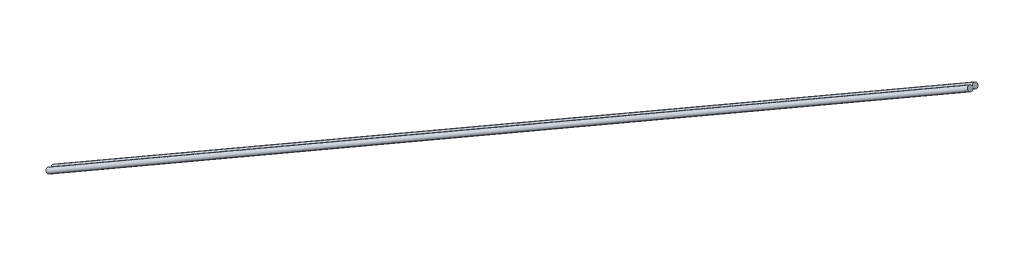
ISO-10303-21;
HEADER;
FILE_DESCRIPTION(('STEP AP214'),'2;1');
FILE_NAME('part.step','',(''),(''),'','','');
FILE_SCHEMA(('AUTOMOTIVE_DESIGN { 1 0 10303 214 1 1 1 1 }'));
ENDSEC;
DATA;
#1=APPLICATION_CONTEXT('core data for automotive mechanical design processes');
#2=APPLICATION_PROTOCOL_DEFINITION('international standard','automotive_design',2000,#1);
#3=PRODUCT_CONTEXT('',#1,'mechanical');
#4=PRODUCT('Part','Part','',(#3));
#5=PRODUCT_RELATED_PRODUCT_CATEGORY('part','',(#4));
#6=PRODUCT_DEFINITION_FORMATION('','',#4);
#7=PRODUCT_DEFINITION_CONTEXT('part definition',#1,'design');
#8=PRODUCT_DEFINITION('design','',#6,#7);
#9=PRODUCT_DEFINITION_SHAPE('','',#8);
#10=(LENGTH_UNIT() NAMED_UNIT(*) SI_UNIT(.MILLI.,.METRE.));
#11=(NAMED_UNIT(*) PLANE_ANGLE_UNIT() SI_UNIT($,.RADIAN.));
#12=(NAMED_UNIT(*) SI_UNIT($,.STERADIAN.) SOLID_ANGLE_UNIT());
#13=UNCERTAINTY_MEASURE_WITH_UNIT(LENGTH_MEASURE(1.E-05),#10,'distance_accuracy_value','');
#14=(GEOMETRIC_REPRESENTATION_CONTEXT(3) GLOBAL_UNCERTAINTY_ASSIGNED_CONTEXT((#13)) GLOBAL_UNIT_ASSIGNED_CONTEXT((#10,
#11,#12)) REPRESENTATION_CONTEXT('',''));
#15=CARTESIAN_POINT('',(0.,0.,0.));
#16=DIRECTION('',(0.,0.,1.));
#17=DIRECTION('',(1.,0.,0.));
#18=AXIS2_PLACEMENT_3D('',#15,#16,#17);
#19=CARTESIAN_POINT('',(216.905828967221,91.7192825120014,0.49));
#20=DIRECTION('',(0.866025403784439,0.5,0.));
#21=DIRECTION('',(-0.5,0.866025403784439,0.));
#22=AXIS2_PLACEMENT_3D('',#19,#20,#21);
#23=CYLINDRICAL_SURFACE('',#22,0.500000000000002);
#24=CARTESIAN_POINT('',(216.905828967221,91.7192825120014,0.49));
#25=DIRECTION('',(0.866025403784439,0.5,0.));
#26=DIRECTION('',(-0.5,0.866025403784439,0.));
#27=AXIS2_PLACEMENT_3D('',#24,#25,#26);
#28=CIRCLE('',#27,0.500000000000002);
#29=CARTESIAN_POINT('',(216.955578339076,91.6331140723033,0.));
#30=VERTEX_POINT('',#29);
#31=CARTESIAN_POINT('',(216.856079595366,91.8054509516995,0.));
#32=VERTEX_POINT('',#31);
#33=EDGE_CURVE('E20',#30,#32,#28,.F.);
#34=ORIENTED_EDGE('',*,*,#33,.T.);
#35=DIRECTION('',(0.866025403784439,0.5,0.));
#36=VECTOR('',#35,1.);
#37=CARTESIAN_POINT('',(216.856079595366,91.8054509516995,0.));
#38=LINE('',#37,#36);
#39=CARTESIAN_POINT('',(34.6152878357357,-13.4113192280534,0.));
#40=VERTEX_POINT('',#39);
#41=EDGE_CURVE('E48',#40,#32,#38,.T.);
#42=ORIENTED_EDGE('',*,*,#41,.F.);
#43=CARTESIAN_POINT('',(34.665037207591,-13.4974876677515,0.49));
#44=DIRECTION('',(0.866025403784439,0.5,0.));
#45=DIRECTION('',(-0.5,0.866025403784439,0.));
#46=AXIS2_PLACEMENT_3D('',#43,#44,#45);
#47=CIRCLE('',#46,0.500000000000002);
#48=CARTESIAN_POINT('',(34.7147865794464,-13.5836561074495,0.));
#49=VERTEX_POINT('',#48);
#50=EDGE_CURVE('E46',#49,#40,#47,.F.);
#51=ORIENTED_EDGE('',*,*,#50,.F.);
#52=DIRECTION('',(0.866025403784439,0.5,0.));
#53=VECTOR('',#52,1.);
#54=CARTESIAN_POINT('',(216.955578339076,91.6331140723033,0.));
#55=LINE('',#54,#53);
#56=EDGE_CURVE('E47',#30,#49,#55,.F.);
#57=ORIENTED_EDGE('',*,*,#56,.F.);
#58=EDGE_LOOP('',(#34,#42,#51,#57));
#59=FACE_BOUND('',#58,.T.);
#60=ADVANCED_FACE('F17',(#59),#23,.T.);
#61=CARTESIAN_POINT('',(34.4150372075911,-13.0644749658592,0.49));
#62=DIRECTION('',(-0.866025403784439,-0.5,0.));
#63=DIRECTION('',(0.5,-0.866025403784439,0.));
#64=AXIS2_PLACEMENT_3D('',#61,#62,#63);
#65=PLANE('',#64);
#66=CARTESIAN_POINT('',(34.6650372075911,-13.4974876677514,-0.49));
#67=DIRECTION('',(0.866025403784439,0.5,0.));
#68=DIRECTION('',(-0.5,0.866025403784439,0.));
#69=AXIS2_PLACEMENT_3D('',#66,#67,#68);
#70=CIRCLE('',#69,0.500000000000002);
#71=EDGE_CURVE('E26',#49,#40,#70,.T.);
#72=ORIENTED_EDGE('',*,*,#71,.F.);
#73=ORIENTED_EDGE('',*,*,#50,.T.);
#74=EDGE_LOOP('',(#72,#73));
#75=FACE_BOUND('',#74,.T.);
#76=ADVANCED_FACE('F50',(#75),#65,.T.);
#77=CARTESIAN_POINT('',(216.905828967221,91.7192825120014,0.49));
#78=DIRECTION('',(0.866025403784439,0.5,0.));
#79=DIRECTION('',(-0.5,0.866025403784439,0.));
#80=AXIS2_PLACEMENT_3D('',#77,#78,#79);
#81=PLANE('',#80);
#82=CARTESIAN_POINT('',(216.905828967221,91.7192825120014,-0.49));
#83=DIRECTION('',(0.866025403784439,0.5,0.));
#84=DIRECTION('',(-0.5,0.866025403784439,0.));
#85=AXIS2_PLACEMENT_3D('',#82,#83,#84);
#86=CIRCLE('',#85,0.500000000000002);
#87=EDGE_CURVE('E11',#32,#30,#86,.F.);
#88=ORIENTED_EDGE('',*,*,#87,.F.);
#89=ORIENTED_EDGE('',*,*,#33,.F.);
#90=EDGE_LOOP('',(#88,#89));
#91=FACE_BOUND('',#90,.T.);
#92=ADVANCED_FACE('F55',(#91),#81,.T.);
#93=CARTESIAN_POINT('',(216.905828967221,91.7192825120014,-0.49));
#94=DIRECTION('',(0.866025403784439,0.5,0.));
#95=DIRECTION('',(-0.5,0.866025403784439,0.));
#96=AXIS2_PLACEMENT_3D('',#93,#94,#95);
#97=CYLINDRICAL_SURFACE('',#96,0.500000000000002);
#98=ORIENTED_EDGE('',*,*,#71,.T.);
#99=ORIENTED_EDGE('',*,*,#41,.T.);
#100=ORIENTED_EDGE('',*,*,#87,.T.);
#101=ORIENTED_EDGE('',*,*,#56,.T.);
#102=EDGE_LOOP('',(#98,#99,#100,#101));
#103=FACE_BOUND('',#102,.T.);
#104=ADVANCED_FACE('F52',(#103),#97,.T.);
#105=CLOSED_SHELL('',(#60,#76,#92,#104));
#106=MANIFOLD_SOLID_BREP('B1',#105);
#107=ADVANCED_BREP_SHAPE_REPRESENTATION('',(#18,#106),#14);
#108=SHAPE_DEFINITION_REPRESENTATION(#9,#107);
ENDSEC;
END-ISO-10303-21;
